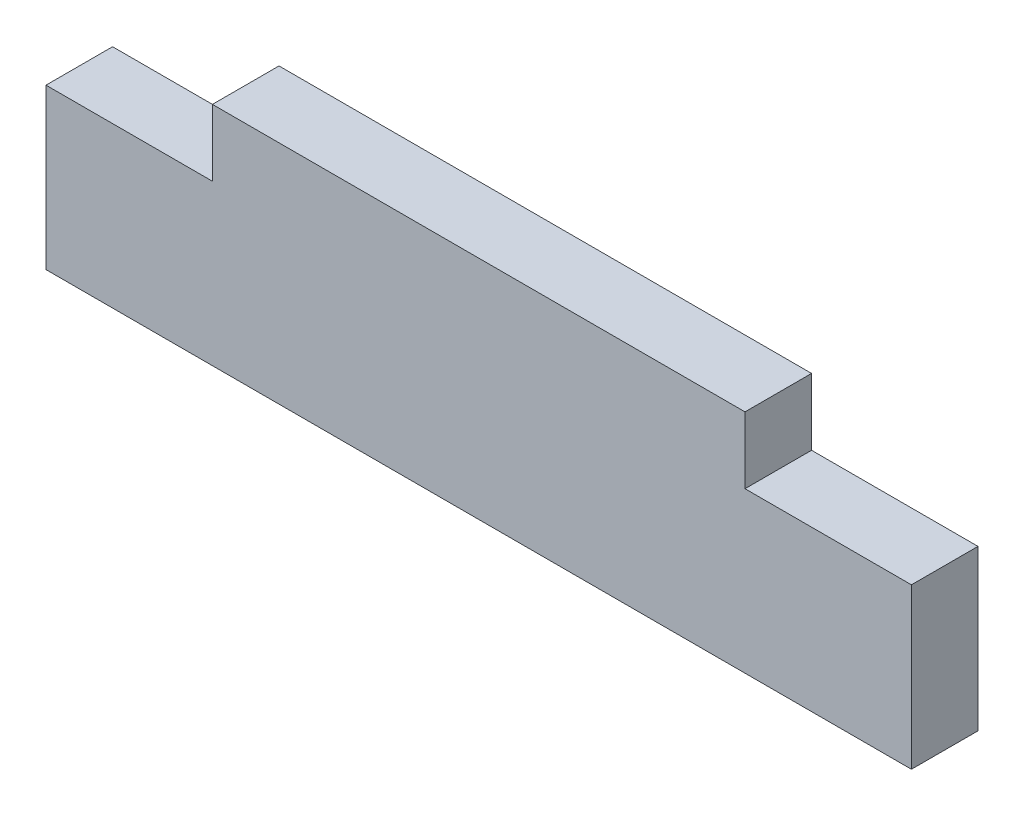
ISO-10303-21;
HEADER;
FILE_DESCRIPTION(('STEP AP214'),'2;1');
FILE_NAME('part.step','',(''),(''),'','','');
FILE_SCHEMA(('AUTOMOTIVE_DESIGN { 1 0 10303 214 1 1 1 1 }'));
ENDSEC;
DATA;
#1=APPLICATION_CONTEXT('core data for automotive mechanical design processes');
#2=APPLICATION_PROTOCOL_DEFINITION('international standard','automotive_design',2000,#1);
#3=PRODUCT_CONTEXT('',#1,'mechanical');
#4=PRODUCT('Part','Part','',(#3));
#5=PRODUCT_RELATED_PRODUCT_CATEGORY('part','',(#4));
#6=PRODUCT_DEFINITION_FORMATION('','',#4);
#7=PRODUCT_DEFINITION_CONTEXT('part definition',#1,'design');
#8=PRODUCT_DEFINITION('design','',#6,#7);
#9=PRODUCT_DEFINITION_SHAPE('','',#8);
#10=(LENGTH_UNIT() NAMED_UNIT(*) SI_UNIT(.MILLI.,.METRE.));
#11=(NAMED_UNIT(*) PLANE_ANGLE_UNIT() SI_UNIT($,.RADIAN.));
#12=(NAMED_UNIT(*) SI_UNIT($,.STERADIAN.) SOLID_ANGLE_UNIT());
#13=UNCERTAINTY_MEASURE_WITH_UNIT(LENGTH_MEASURE(1.E-05),#10,'distance_accuracy_value','');
#14=(GEOMETRIC_REPRESENTATION_CONTEXT(3) GLOBAL_UNCERTAINTY_ASSIGNED_CONTEXT((#13)) GLOBAL_UNIT_ASSIGNED_CONTEXT((#10,
#11,#12)) REPRESENTATION_CONTEXT('',''));
#15=CARTESIAN_POINT('',(0.,0.,0.));
#16=DIRECTION('',(0.,0.,1.));
#17=DIRECTION('',(1.,0.,0.));
#18=AXIS2_PLACEMENT_3D('',#15,#16,#17);
#19=CARTESIAN_POINT('',(-20.,12.,5.));
#20=DIRECTION('',(0.,-1.,0.));
#21=DIRECTION('',(1.,0.,0.));
#22=AXIS2_PLACEMENT_3D('',#19,#20,#21);
#23=PLANE('',#22);
#24=DIRECTION('',(-1.,0.,0.));
#25=VECTOR('',#24,1.);
#26=CARTESIAN_POINT('',(-20.,12.,0.));
#27=LINE('',#26,#25);
#28=CARTESIAN_POINT('',(-20.,12.,0.));
#29=VERTEX_POINT('',#28);
#30=CARTESIAN_POINT('',(-32.5,12.,0.));
#31=VERTEX_POINT('',#30);
#32=EDGE_CURVE('E140',#29,#31,#27,.T.);
#33=ORIENTED_EDGE('',*,*,#32,.T.);
#34=DIRECTION('',(0.,0.,-1.));
#35=VECTOR('',#34,1.);
#36=CARTESIAN_POINT('',(-32.5,12.,5.));
#37=LINE('',#36,#35);
#38=CARTESIAN_POINT('',(-32.5,12.,5.));
#39=VERTEX_POINT('',#38);
#40=EDGE_CURVE('E11',#39,#31,#37,.T.);
#41=ORIENTED_EDGE('',*,*,#40,.F.);
#42=DIRECTION('',(-1.,0.,0.));
#43=VECTOR('',#42,1.);
#44=CARTESIAN_POINT('',(-20.,12.,5.));
#45=LINE('',#44,#43);
#46=CARTESIAN_POINT('',(-20.,12.,5.));
#47=VERTEX_POINT('',#46);
#48=EDGE_CURVE('E162',#47,#39,#45,.T.);
#49=ORIENTED_EDGE('',*,*,#48,.F.);
#50=DIRECTION('',(0.,0.,-1.));
#51=VECTOR('',#50,1.);
#52=CARTESIAN_POINT('',(-20.,12.,5.));
#53=LINE('',#52,#51);
#54=EDGE_CURVE('E136',#47,#29,#53,.T.);
#55=ORIENTED_EDGE('',*,*,#54,.T.);
#56=EDGE_LOOP('',(#33,#41,#49,#55));
#57=FACE_BOUND('',#56,.T.);
#58=ADVANCED_FACE('F39',(#57),#23,.F.);
#59=CARTESIAN_POINT('',(-32.5,12.,5.));
#60=DIRECTION('',(1.,0.,0.));
#61=DIRECTION('',(0.,0.,-1.));
#62=AXIS2_PLACEMENT_3D('',#59,#60,#61);
#63=PLANE('',#62);
#64=DIRECTION('',(0.,-1.,0.));
#65=VECTOR('',#64,1.);
#66=CARTESIAN_POINT('',(-32.5,12.,0.));
#67=LINE('',#66,#65);
#68=CARTESIAN_POINT('',(-32.5,0.,0.));
#69=VERTEX_POINT('',#68);
#70=EDGE_CURVE('E144',#31,#69,#67,.T.);
#71=ORIENTED_EDGE('',*,*,#70,.T.);
#72=DIRECTION('',(0.,0.,-1.));
#73=VECTOR('',#72,1.);
#74=CARTESIAN_POINT('',(-32.5,0.,5.));
#75=LINE('',#74,#73);
#76=CARTESIAN_POINT('',(-32.5,0.,5.));
#77=VERTEX_POINT('',#76);
#78=EDGE_CURVE('E48',#77,#69,#75,.T.);
#79=ORIENTED_EDGE('',*,*,#78,.F.);
#80=DIRECTION('',(0.,-1.,0.));
#81=VECTOR('',#80,1.);
#82=CARTESIAN_POINT('',(-32.5,12.,5.));
#83=LINE('',#82,#81);
#84=EDGE_CURVE('E99',#39,#77,#83,.T.);
#85=ORIENTED_EDGE('',*,*,#84,.F.);
#86=ORIENTED_EDGE('',*,*,#40,.T.);
#87=EDGE_LOOP('',(#71,#79,#85,#86));
#88=FACE_BOUND('',#87,.T.);
#89=ADVANCED_FACE('F208',(#88),#63,.F.);
#90=CARTESIAN_POINT('',(-32.5,0.,5.));
#91=DIRECTION('',(0.,1.,0.));
#92=DIRECTION('',(0.,0.,1.));
#93=AXIS2_PLACEMENT_3D('',#90,#91,#92);
#94=PLANE('',#93);
#95=DIRECTION('',(1.,0.,0.));
#96=VECTOR('',#95,1.);
#97=CARTESIAN_POINT('',(-32.5,0.,0.));
#98=LINE('',#97,#96);
#99=CARTESIAN_POINT('',(32.5,0.,0.));
#100=VERTEX_POINT('',#99);
#101=EDGE_CURVE('E147',#69,#100,#98,.T.);
#102=ORIENTED_EDGE('',*,*,#101,.T.);
#103=DIRECTION('',(0.,0.,-1.));
#104=VECTOR('',#103,1.);
#105=CARTESIAN_POINT('',(32.5,0.,5.));
#106=LINE('',#105,#104);
#107=CARTESIAN_POINT('',(32.5,0.,5.));
#108=VERTEX_POINT('',#107);
#109=EDGE_CURVE('E173',#108,#100,#106,.T.);
#110=ORIENTED_EDGE('',*,*,#109,.F.);
#111=DIRECTION('',(1.,0.,0.));
#112=VECTOR('',#111,1.);
#113=CARTESIAN_POINT('',(-32.5,0.,5.));
#114=LINE('',#113,#112);
#115=EDGE_CURVE('E183',#77,#108,#114,.T.);
#116=ORIENTED_EDGE('',*,*,#115,.F.);
#117=ORIENTED_EDGE('',*,*,#78,.T.);
#118=EDGE_LOOP('',(#102,#110,#116,#117));
#119=FACE_BOUND('',#118,.T.);
#120=ADVANCED_FACE('F181',(#119),#94,.F.);
#121=CARTESIAN_POINT('',(32.5,12.,5.));
#122=DIRECTION('',(-1.,0.,0.));
#123=DIRECTION('',(0.,0.,1.));
#124=AXIS2_PLACEMENT_3D('',#121,#122,#123);
#125=PLANE('',#124);
#126=DIRECTION('',(0.,1.,0.));
#127=VECTOR('',#126,1.);
#128=CARTESIAN_POINT('',(32.5,12.,0.));
#129=LINE('',#128,#127);
#130=CARTESIAN_POINT('',(32.5,12.,0.));
#131=VERTEX_POINT('',#130);
#132=EDGE_CURVE('E150',#100,#131,#129,.T.);
#133=ORIENTED_EDGE('',*,*,#132,.T.);
#134=DIRECTION('',(0.,0.,-1.));
#135=VECTOR('',#134,1.);
#136=CARTESIAN_POINT('',(32.5,12.,5.));
#137=LINE('',#136,#135);
#138=CARTESIAN_POINT('',(32.5,12.,5.));
#139=VERTEX_POINT('',#138);
#140=EDGE_CURVE('E169',#139,#131,#137,.T.);
#141=ORIENTED_EDGE('',*,*,#140,.F.);
#142=DIRECTION('',(0.,1.,0.));
#143=VECTOR('',#142,1.);
#144=CARTESIAN_POINT('',(32.5,12.,5.));
#145=LINE('',#144,#143);
#146=EDGE_CURVE('E196',#108,#139,#145,.T.);
#147=ORIENTED_EDGE('',*,*,#146,.F.);
#148=ORIENTED_EDGE('',*,*,#109,.T.);
#149=EDGE_LOOP('',(#133,#141,#147,#148));
#150=FACE_BOUND('',#149,.T.);
#151=ADVANCED_FACE('F191',(#150),#125,.F.);
#152=CARTESIAN_POINT('',(20.,12.,5.));
#153=DIRECTION('',(0.,-1.,0.));
#154=DIRECTION('',(1.,0.,0.));
#155=AXIS2_PLACEMENT_3D('',#152,#153,#154);
#156=PLANE('',#155);
#157=DIRECTION('',(-1.,0.,0.));
#158=VECTOR('',#157,1.);
#159=CARTESIAN_POINT('',(20.,12.,0.));
#160=LINE('',#159,#158);
#161=CARTESIAN_POINT('',(20.,12.,0.));
#162=VERTEX_POINT('',#161);
#163=EDGE_CURVE('E153',#131,#162,#160,.T.);
#164=ORIENTED_EDGE('',*,*,#163,.T.);
#165=DIRECTION('',(0.,0.,-1.));
#166=VECTOR('',#165,1.);
#167=CARTESIAN_POINT('',(20.,12.,5.));
#168=LINE('',#167,#166);
#169=CARTESIAN_POINT('',(20.,12.,5.));
#170=VERTEX_POINT('',#169);
#171=EDGE_CURVE('E129',#170,#162,#168,.T.);
#172=ORIENTED_EDGE('',*,*,#171,.F.);
#173=DIRECTION('',(-1.,0.,0.));
#174=VECTOR('',#173,1.);
#175=CARTESIAN_POINT('',(20.,12.,5.));
#176=LINE('',#175,#174);
#177=EDGE_CURVE('E118',#139,#170,#176,.T.);
#178=ORIENTED_EDGE('',*,*,#177,.F.);
#179=ORIENTED_EDGE('',*,*,#140,.T.);
#180=EDGE_LOOP('',(#164,#172,#178,#179));
#181=FACE_BOUND('',#180,.T.);
#182=ADVANCED_FACE('F194',(#181),#156,.F.);
#183=CARTESIAN_POINT('',(20.,17.,5.));
#184=DIRECTION('',(-1.,0.,0.));
#185=DIRECTION('',(0.,0.,1.));
#186=AXIS2_PLACEMENT_3D('',#183,#184,#185);
#187=PLANE('',#186);
#188=DIRECTION('',(0.,1.,0.));
#189=VECTOR('',#188,1.);
#190=CARTESIAN_POINT('',(20.,17.,0.));
#191=LINE('',#190,#189);
#192=CARTESIAN_POINT('',(20.,17.,0.));
#193=VERTEX_POINT('',#192);
#194=EDGE_CURVE('E127',#162,#193,#191,.T.);
#195=ORIENTED_EDGE('',*,*,#194,.T.);
#196=DIRECTION('',(0.,0.,-1.));
#197=VECTOR('',#196,1.);
#198=CARTESIAN_POINT('',(20.,17.,5.));
#199=LINE('',#198,#197);
#200=CARTESIAN_POINT('',(20.,17.,5.));
#201=VERTEX_POINT('',#200);
#202=EDGE_CURVE('E124',#201,#193,#199,.T.);
#203=ORIENTED_EDGE('',*,*,#202,.F.);
#204=DIRECTION('',(0.,1.,0.));
#205=VECTOR('',#204,1.);
#206=CARTESIAN_POINT('',(20.,17.,5.));
#207=LINE('',#206,#205);
#208=EDGE_CURVE('E112',#170,#201,#207,.T.);
#209=ORIENTED_EDGE('',*,*,#208,.F.);
#210=ORIENTED_EDGE('',*,*,#171,.T.);
#211=EDGE_LOOP('',(#195,#203,#209,#210));
#212=FACE_BOUND('',#211,.T.);
#213=ADVANCED_FACE('F125',(#212),#187,.F.);
#214=CARTESIAN_POINT('',(20.,17.,5.));
#215=DIRECTION('',(0.,-1.,0.));
#216=DIRECTION('',(0.,0.,-1.));
#217=AXIS2_PLACEMENT_3D('',#214,#215,#216);
#218=PLANE('',#217);
#219=DIRECTION('',(-1.,0.,0.));
#220=VECTOR('',#219,1.);
#221=CARTESIAN_POINT('',(20.,17.,0.));
#222=LINE('',#221,#220);
#223=CARTESIAN_POINT('',(-20.,17.,0.));
#224=VERTEX_POINT('',#223);
#225=EDGE_CURVE('E85',#193,#224,#222,.T.);
#226=ORIENTED_EDGE('',*,*,#225,.T.);
#227=DIRECTION('',(0.,0.,-1.));
#228=VECTOR('',#227,1.);
#229=CARTESIAN_POINT('',(-20.,17.,5.));
#230=LINE('',#229,#228);
#231=CARTESIAN_POINT('',(-20.,17.,5.));
#232=VERTEX_POINT('',#231);
#233=EDGE_CURVE('E130',#232,#224,#230,.T.);
#234=ORIENTED_EDGE('',*,*,#233,.F.);
#235=DIRECTION('',(-1.,0.,0.));
#236=VECTOR('',#235,1.);
#237=CARTESIAN_POINT('',(20.,17.,5.));
#238=LINE('',#237,#236);
#239=EDGE_CURVE('E116',#201,#232,#238,.T.);
#240=ORIENTED_EDGE('',*,*,#239,.F.);
#241=ORIENTED_EDGE('',*,*,#202,.T.);
#242=EDGE_LOOP('',(#226,#234,#240,#241));
#243=FACE_BOUND('',#242,.T.);
#244=ADVANCED_FACE('F132',(#243),#218,.F.);
#245=CARTESIAN_POINT('',(-20.,17.,5.));
#246=DIRECTION('',(1.,0.,0.));
#247=DIRECTION('',(0.,0.,-1.));
#248=AXIS2_PLACEMENT_3D('',#245,#246,#247);
#249=PLANE('',#248);
#250=DIRECTION('',(0.,-1.,0.));
#251=VECTOR('',#250,1.);
#252=CARTESIAN_POINT('',(-20.,17.,0.));
#253=LINE('',#252,#251);
#254=EDGE_CURVE('E91',#224,#29,#253,.T.);
#255=ORIENTED_EDGE('',*,*,#254,.T.);
#256=ORIENTED_EDGE('',*,*,#54,.F.);
#257=DIRECTION('',(0.,-1.,0.));
#258=VECTOR('',#257,1.);
#259=CARTESIAN_POINT('',(-20.,17.,5.));
#260=LINE('',#259,#258);
#261=EDGE_CURVE('E56',#232,#47,#260,.T.);
#262=ORIENTED_EDGE('',*,*,#261,.F.);
#263=ORIENTED_EDGE('',*,*,#233,.T.);
#264=EDGE_LOOP('',(#255,#256,#262,#263));
#265=FACE_BOUND('',#264,.T.);
#266=ADVANCED_FACE('F224',(#265),#249,.F.);
#267=CARTESIAN_POINT('',(0.,0.,5.));
#268=DIRECTION('',(0.,0.,1.));
#269=DIRECTION('',(1.,0.,0.));
#270=AXIS2_PLACEMENT_3D('',#267,#268,#269);
#271=PLANE('',#270);
#272=ORIENTED_EDGE('',*,*,#48,.T.);
#273=ORIENTED_EDGE('',*,*,#84,.T.);
#274=ORIENTED_EDGE('',*,*,#115,.T.);
#275=ORIENTED_EDGE('',*,*,#146,.T.);
#276=ORIENTED_EDGE('',*,*,#177,.T.);
#277=ORIENTED_EDGE('',*,*,#208,.T.);
#278=ORIENTED_EDGE('',*,*,#239,.T.);
#279=ORIENTED_EDGE('',*,*,#261,.T.);
#280=EDGE_LOOP('',(#272,#273,#274,#275,#276,#277,#278,#279));
#281=FACE_BOUND('',#280,.T.);
#282=ADVANCED_FACE('F114',(#281),#271,.T.);
#283=CARTESIAN_POINT('',(0.,0.,0.));
#284=DIRECTION('',(0.,0.,1.));
#285=DIRECTION('',(1.,0.,0.));
#286=AXIS2_PLACEMENT_3D('',#283,#284,#285);
#287=PLANE('',#286);
#288=ORIENTED_EDGE('',*,*,#32,.F.);
#289=ORIENTED_EDGE('',*,*,#254,.F.);
#290=ORIENTED_EDGE('',*,*,#225,.F.);
#291=ORIENTED_EDGE('',*,*,#194,.F.);
#292=ORIENTED_EDGE('',*,*,#163,.F.);
#293=ORIENTED_EDGE('',*,*,#132,.F.);
#294=ORIENTED_EDGE('',*,*,#101,.F.);
#295=ORIENTED_EDGE('',*,*,#70,.F.);
#296=EDGE_LOOP('',(#288,#289,#290,#291,#292,#293,#294,#295));
#297=FACE_BOUND('',#296,.T.);
#298=ADVANCED_FACE('F187',(#297),#287,.F.);
#299=CLOSED_SHELL('',(#58,#89,#120,#151,#182,#213,#244,#266,#282,#298));
#300=MANIFOLD_SOLID_BREP('B2',#299);
#301=ADVANCED_BREP_SHAPE_REPRESENTATION('',(#18,#300),#14);
#302=SHAPE_DEFINITION_REPRESENTATION(#9,#301);
ENDSEC;
END-ISO-10303-21;
